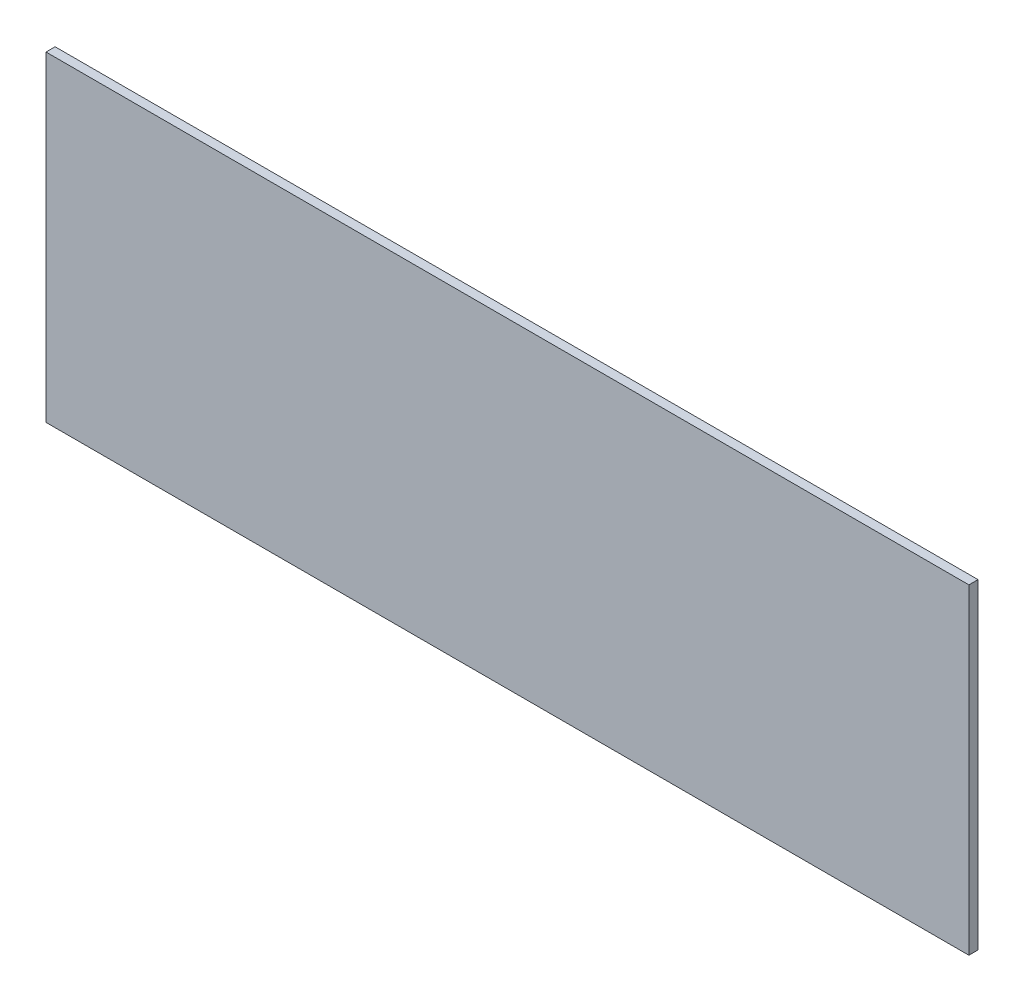
ISO-10303-21;
HEADER;
FILE_DESCRIPTION(('STEP AP214'),'2;1');
FILE_NAME('part.step','',(''),(''),'','','');
FILE_SCHEMA(('AUTOMOTIVE_DESIGN { 1 0 10303 214 1 1 1 1 }'));
ENDSEC;
DATA;
#1=APPLICATION_CONTEXT('core data for automotive mechanical design processes');
#2=APPLICATION_PROTOCOL_DEFINITION('international standard','automotive_design',2000,#1);
#3=PRODUCT_CONTEXT('',#1,'mechanical');
#4=PRODUCT('Part','Part','',(#3));
#5=PRODUCT_RELATED_PRODUCT_CATEGORY('part','',(#4));
#6=PRODUCT_DEFINITION_FORMATION('','',#4);
#7=PRODUCT_DEFINITION_CONTEXT('part definition',#1,'design');
#8=PRODUCT_DEFINITION('design','',#6,#7);
#9=PRODUCT_DEFINITION_SHAPE('','',#8);
#10=(LENGTH_UNIT() NAMED_UNIT(*) SI_UNIT(.MILLI.,.METRE.));
#11=(NAMED_UNIT(*) PLANE_ANGLE_UNIT() SI_UNIT($,.RADIAN.));
#12=(NAMED_UNIT(*) SI_UNIT($,.STERADIAN.) SOLID_ANGLE_UNIT());
#13=UNCERTAINTY_MEASURE_WITH_UNIT(LENGTH_MEASURE(1.E-05),#10,'distance_accuracy_value','');
#14=(GEOMETRIC_REPRESENTATION_CONTEXT(3) GLOBAL_UNCERTAINTY_ASSIGNED_CONTEXT((#13)) GLOBAL_UNIT_ASSIGNED_CONTEXT((#10,
#11,#12)) REPRESENTATION_CONTEXT('',''));
#15=CARTESIAN_POINT('',(0.,0.,0.));
#16=DIRECTION('',(0.,0.,1.));
#17=DIRECTION('',(1.,0.,0.));
#18=AXIS2_PLACEMENT_3D('',#15,#16,#17);
#19=CARTESIAN_POINT('',(120.65,-41.9354,2.38125));
#20=DIRECTION('',(-1.,0.,0.));
#21=DIRECTION('',(0.,0.,1.));
#22=AXIS2_PLACEMENT_3D('',#19,#20,#21);
#23=PLANE('',#22);
#24=DIRECTION('',(0.,1.,0.));
#25=VECTOR('',#24,1.);
#26=CARTESIAN_POINT('',(120.65,-41.9354,0.));
#27=LINE('',#26,#25);
#28=CARTESIAN_POINT('',(120.65,-41.9354,0.));
#29=VERTEX_POINT('',#28);
#30=CARTESIAN_POINT('',(120.65,41.9354,0.));
#31=VERTEX_POINT('',#30);
#32=EDGE_CURVE('E96',#29,#31,#27,.T.);
#33=ORIENTED_EDGE('',*,*,#32,.T.);
#34=DIRECTION('',(0.,0.,-1.));
#35=VECTOR('',#34,1.);
#36=CARTESIAN_POINT('',(120.65,41.9354,2.38125));
#37=LINE('',#36,#35);
#38=CARTESIAN_POINT('',(120.65,41.9354,2.38125));
#39=VERTEX_POINT('',#38);
#40=EDGE_CURVE('E11',#39,#31,#37,.T.);
#41=ORIENTED_EDGE('',*,*,#40,.F.);
#42=DIRECTION('',(0.,1.,0.));
#43=VECTOR('',#42,1.);
#44=CARTESIAN_POINT('',(120.65,-41.9354,2.38125));
#45=LINE('',#44,#43);
#46=CARTESIAN_POINT('',(120.65,-41.9354,2.38125));
#47=VERTEX_POINT('',#46);
#48=EDGE_CURVE('E84',#47,#39,#45,.T.);
#49=ORIENTED_EDGE('',*,*,#48,.F.);
#50=DIRECTION('',(0.,0.,-1.));
#51=VECTOR('',#50,1.);
#52=CARTESIAN_POINT('',(120.65,-41.9354,2.38125));
#53=LINE('',#52,#51);
#54=EDGE_CURVE('E92',#47,#29,#53,.T.);
#55=ORIENTED_EDGE('',*,*,#54,.T.);
#56=EDGE_LOOP('',(#33,#41,#49,#55));
#57=FACE_BOUND('',#56,.T.);
#58=ADVANCED_FACE('F33',(#57),#23,.F.);
#59=CARTESIAN_POINT('',(-120.65,41.9354,2.38125));
#60=DIRECTION('',(0.,-1.,0.));
#61=DIRECTION('',(0.,0.,-1.));
#62=AXIS2_PLACEMENT_3D('',#59,#60,#61);
#63=PLANE('',#62);
#64=DIRECTION('',(-1.,0.,0.));
#65=VECTOR('',#64,1.);
#66=CARTESIAN_POINT('',(-120.65,41.9354,0.));
#67=LINE('',#66,#65);
#68=CARTESIAN_POINT('',(-120.65,41.9354,0.));
#69=VERTEX_POINT('',#68);
#70=EDGE_CURVE('E88',#31,#69,#67,.T.);
#71=ORIENTED_EDGE('',*,*,#70,.T.);
#72=DIRECTION('',(0.,0.,-1.));
#73=VECTOR('',#72,1.);
#74=CARTESIAN_POINT('',(-120.65,41.9354,2.38125));
#75=LINE('',#74,#73);
#76=CARTESIAN_POINT('',(-120.65,41.9354,2.38125));
#77=VERTEX_POINT('',#76);
#78=EDGE_CURVE('E41',#77,#69,#75,.T.);
#79=ORIENTED_EDGE('',*,*,#78,.F.);
#80=DIRECTION('',(-1.,0.,0.));
#81=VECTOR('',#80,1.);
#82=CARTESIAN_POINT('',(-120.65,41.9354,2.38125));
#83=LINE('',#82,#81);
#84=EDGE_CURVE('E79',#39,#77,#83,.T.);
#85=ORIENTED_EDGE('',*,*,#84,.F.);
#86=ORIENTED_EDGE('',*,*,#40,.T.);
#87=EDGE_LOOP('',(#71,#79,#85,#86));
#88=FACE_BOUND('',#87,.T.);
#89=ADVANCED_FACE('F87',(#88),#63,.F.);
#90=CARTESIAN_POINT('',(-120.65,-41.9354,2.38125));
#91=DIRECTION('',(1.,0.,0.));
#92=DIRECTION('',(0.,0.,-1.));
#93=AXIS2_PLACEMENT_3D('',#90,#91,#92);
#94=PLANE('',#93);
#95=DIRECTION('',(0.,-1.,0.));
#96=VECTOR('',#95,1.);
#97=CARTESIAN_POINT('',(-120.65,-41.9354,0.));
#98=LINE('',#97,#96);
#99=CARTESIAN_POINT('',(-120.65,-41.9354,0.));
#100=VERTEX_POINT('',#99);
#101=EDGE_CURVE('E66',#69,#100,#98,.T.);
#102=ORIENTED_EDGE('',*,*,#101,.T.);
#103=DIRECTION('',(0.,0.,-1.));
#104=VECTOR('',#103,1.);
#105=CARTESIAN_POINT('',(-120.65,-41.9354,2.38125));
#106=LINE('',#105,#104);
#107=CARTESIAN_POINT('',(-120.65,-41.9354,2.38125));
#108=VERTEX_POINT('',#107);
#109=EDGE_CURVE('E89',#108,#100,#106,.T.);
#110=ORIENTED_EDGE('',*,*,#109,.F.);
#111=DIRECTION('',(0.,-1.,0.));
#112=VECTOR('',#111,1.);
#113=CARTESIAN_POINT('',(-120.65,-41.9354,2.38125));
#114=LINE('',#113,#112);
#115=EDGE_CURVE('E82',#77,#108,#114,.T.);
#116=ORIENTED_EDGE('',*,*,#115,.F.);
#117=ORIENTED_EDGE('',*,*,#78,.T.);
#118=EDGE_LOOP('',(#102,#110,#116,#117));
#119=FACE_BOUND('',#118,.T.);
#120=ADVANCED_FACE('F90',(#119),#94,.F.);
#121=CARTESIAN_POINT('',(-120.65,-41.9354,2.38125));
#122=DIRECTION('',(0.,1.,0.));
#123=DIRECTION('',(0.,0.,1.));
#124=AXIS2_PLACEMENT_3D('',#121,#122,#123);
#125=PLANE('',#124);
#126=DIRECTION('',(1.,0.,0.));
#127=VECTOR('',#126,1.);
#128=CARTESIAN_POINT('',(-120.65,-41.9354,0.));
#129=LINE('',#128,#127);
#130=EDGE_CURVE('E72',#100,#29,#129,.T.);
#131=ORIENTED_EDGE('',*,*,#130,.T.);
#132=ORIENTED_EDGE('',*,*,#54,.F.);
#133=DIRECTION('',(1.,0.,0.));
#134=VECTOR('',#133,1.);
#135=CARTESIAN_POINT('',(-120.65,-41.9354,2.38125));
#136=LINE('',#135,#134);
#137=EDGE_CURVE('E49',#108,#47,#136,.T.);
#138=ORIENTED_EDGE('',*,*,#137,.F.);
#139=ORIENTED_EDGE('',*,*,#109,.T.);
#140=EDGE_LOOP('',(#131,#132,#138,#139));
#141=FACE_BOUND('',#140,.T.);
#142=ADVANCED_FACE('F103',(#141),#125,.F.);
#143=CARTESIAN_POINT('',(0.,0.,2.38125));
#144=DIRECTION('',(0.,0.,-1.));
#145=DIRECTION('',(-1.,0.,0.));
#146=AXIS2_PLACEMENT_3D('',#143,#144,#145);
#147=PLANE('',#146);
#148=ORIENTED_EDGE('',*,*,#48,.T.);
#149=ORIENTED_EDGE('',*,*,#84,.T.);
#150=ORIENTED_EDGE('',*,*,#115,.T.);
#151=ORIENTED_EDGE('',*,*,#137,.T.);
#152=EDGE_LOOP('',(#148,#149,#150,#151));
#153=FACE_BOUND('',#152,.T.);
#154=ADVANCED_FACE('F80',(#153),#147,.F.);
#155=CARTESIAN_POINT('',(0.,0.,0.));
#156=DIRECTION('',(0.,0.,-1.));
#157=DIRECTION('',(-1.,0.,0.));
#158=AXIS2_PLACEMENT_3D('',#155,#156,#157);
#159=PLANE('',#158);
#160=ORIENTED_EDGE('',*,*,#32,.F.);
#161=ORIENTED_EDGE('',*,*,#130,.F.);
#162=ORIENTED_EDGE('',*,*,#101,.F.);
#163=ORIENTED_EDGE('',*,*,#70,.F.);
#164=EDGE_LOOP('',(#160,#161,#162,#163));
#165=FACE_BOUND('',#164,.T.);
#166=ADVANCED_FACE('F106',(#165),#159,.T.);
#167=CLOSED_SHELL('',(#58,#89,#120,#142,#154,#166));
#168=MANIFOLD_SOLID_BREP('B2',#167);
#169=ADVANCED_BREP_SHAPE_REPRESENTATION('',(#18,#168),#14);
#170=SHAPE_DEFINITION_REPRESENTATION(#9,#169);
ENDSEC;
END-ISO-10303-21;
